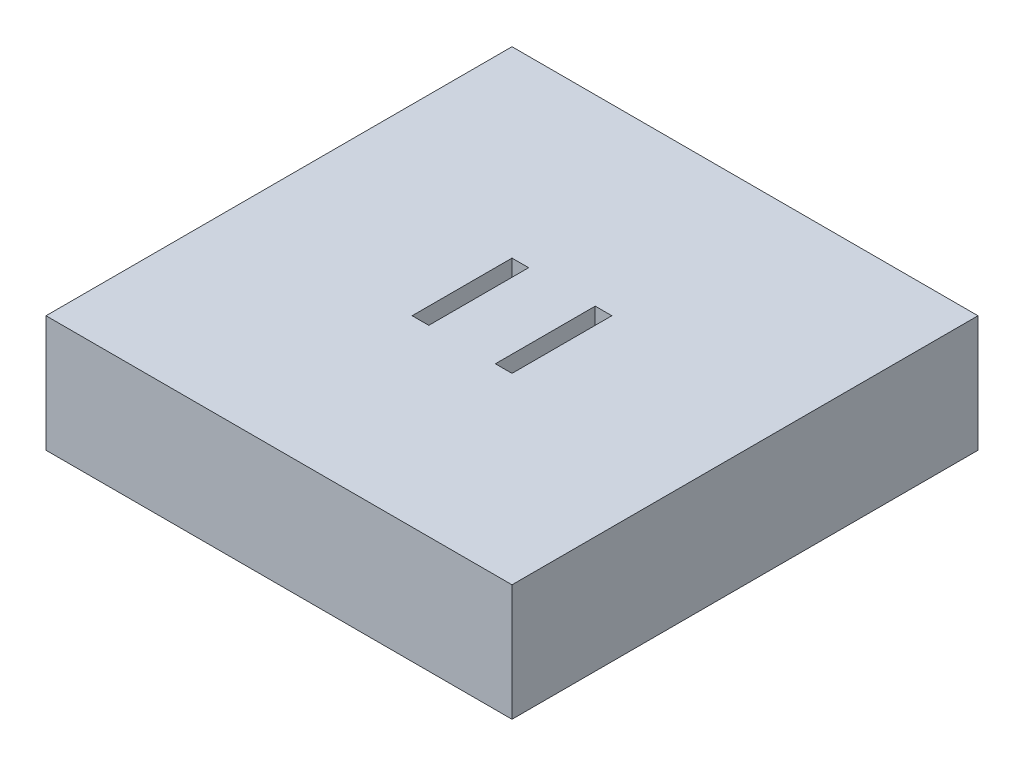
ISO-10303-21;
HEADER;
FILE_DESCRIPTION(('STEP AP214'),'2;1');
FILE_NAME('part.step','',(''),(''),'','','');
FILE_SCHEMA(('AUTOMOTIVE_DESIGN { 1 0 10303 214 1 1 1 1 }'));
ENDSEC;
DATA;
#1=APPLICATION_CONTEXT('core data for automotive mechanical design processes');
#2=APPLICATION_PROTOCOL_DEFINITION('international standard','automotive_design',2000,#1);
#3=PRODUCT_CONTEXT('',#1,'mechanical');
#4=PRODUCT('Part','Part','',(#3));
#5=PRODUCT_RELATED_PRODUCT_CATEGORY('part','',(#4));
#6=PRODUCT_DEFINITION_FORMATION('','',#4);
#7=PRODUCT_DEFINITION_CONTEXT('part definition',#1,'design');
#8=PRODUCT_DEFINITION('design','',#6,#7);
#9=PRODUCT_DEFINITION_SHAPE('','',#8);
#10=(LENGTH_UNIT() NAMED_UNIT(*) SI_UNIT(.MILLI.,.METRE.));
#11=(NAMED_UNIT(*) PLANE_ANGLE_UNIT() SI_UNIT($,.RADIAN.));
#12=(NAMED_UNIT(*) SI_UNIT($,.STERADIAN.) SOLID_ANGLE_UNIT());
#13=UNCERTAINTY_MEASURE_WITH_UNIT(LENGTH_MEASURE(1.E-05),#10,'distance_accuracy_value','');
#14=(GEOMETRIC_REPRESENTATION_CONTEXT(3) GLOBAL_UNCERTAINTY_ASSIGNED_CONTEXT((#13)) GLOBAL_UNIT_ASSIGNED_CONTEXT((#10,
#11,#12)) REPRESENTATION_CONTEXT('',''));
#15=CARTESIAN_POINT('',(0.,0.,0.));
#16=DIRECTION('',(0.,0.,1.));
#17=DIRECTION('',(1.,0.,0.));
#18=AXIS2_PLACEMENT_3D('',#15,#16,#17);
#19=CARTESIAN_POINT('',(0.,-2.5,0.));
#20=DIRECTION('',(0.,1.,0.));
#21=DIRECTION('',(0.,0.,1.));
#22=AXIS2_PLACEMENT_3D('',#19,#20,#21);
#23=PLANE('',#22);
#24=DIRECTION('',(0.,0.,1.));
#25=VECTOR('',#24,1.);
#26=CARTESIAN_POINT('',(-14.,-2.5,14.));
#27=LINE('',#26,#25);
#28=CARTESIAN_POINT('',(-14.,-2.5,-14.));
#29=VERTEX_POINT('',#28);
#30=CARTESIAN_POINT('',(-14.,-2.5,14.));
#31=VERTEX_POINT('',#30);
#32=EDGE_CURVE('E245',#29,#31,#27,.T.);
#33=ORIENTED_EDGE('',*,*,#32,.F.);
#34=DIRECTION('',(-1.,0.,0.));
#35=VECTOR('',#34,1.);
#36=CARTESIAN_POINT('',(14.,-2.5,-14.));
#37=LINE('',#36,#35);
#38=CARTESIAN_POINT('',(14.,-2.5,-14.));
#39=VERTEX_POINT('',#38);
#40=EDGE_CURVE('E252',#39,#29,#37,.T.);
#41=ORIENTED_EDGE('',*,*,#40,.F.);
#42=DIRECTION('',(0.,0.,-1.));
#43=VECTOR('',#42,1.);
#44=CARTESIAN_POINT('',(14.,-2.5,14.));
#45=LINE('',#44,#43);
#46=CARTESIAN_POINT('',(14.,-2.5,14.));
#47=VERTEX_POINT('',#46);
#48=EDGE_CURVE('E250',#47,#39,#45,.T.);
#49=ORIENTED_EDGE('',*,*,#48,.F.);
#50=DIRECTION('',(1.,0.,0.));
#51=VECTOR('',#50,1.);
#52=CARTESIAN_POINT('',(14.,-2.5,14.));
#53=LINE('',#52,#51);
#54=EDGE_CURVE('E248',#31,#47,#53,.T.);
#55=ORIENTED_EDGE('',*,*,#54,.F.);
#56=EDGE_LOOP('',(#33,#41,#49,#55));
#57=FACE_BOUND('',#56,.T.);
#58=CARTESIAN_POINT('',(0.,-2.5,0.));
#59=DIRECTION('',(0.,1.,0.));
#60=DIRECTION('',(0.,0.,1.));
#61=AXIS2_PLACEMENT_3D('',#58,#59,#60);
#62=CIRCLE('',#61,10.625);
#63=CARTESIAN_POINT('',(0.,-2.5,10.625));
#64=VERTEX_POINT('',#63);
#65=EDGE_CURVE('E242',#64,#64,#62,.T.);
#66=ORIENTED_EDGE('',*,*,#65,.T.);
#67=EDGE_LOOP('',(#66));
#68=FACE_BOUND('',#67,.T.);
#69=ADVANCED_FACE('F35',(#57,#68),#23,.F.);
#70=CARTESIAN_POINT('',(-14.,2.5,14.));
#71=DIRECTION('',(1.,0.,0.));
#72=DIRECTION('',(0.,0.,-1.));
#73=AXIS2_PLACEMENT_3D('',#70,#71,#72);
#74=PLANE('',#73);
#75=ORIENTED_EDGE('',*,*,#32,.T.);
#76=DIRECTION('',(0.,-1.,0.));
#77=VECTOR('',#76,1.);
#78=CARTESIAN_POINT('',(-14.,2.5,14.));
#79=LINE('',#78,#77);
#80=CARTESIAN_POINT('',(-14.,4.5,14.));
#81=VERTEX_POINT('',#80);
#82=EDGE_CURVE('E159',#81,#31,#79,.T.);
#83=ORIENTED_EDGE('',*,*,#82,.F.);
#84=DIRECTION('',(0.,0.,1.));
#85=VECTOR('',#84,1.);
#86=CARTESIAN_POINT('',(-14.,4.5,-14.));
#87=LINE('',#86,#85);
#88=CARTESIAN_POINT('',(-14.,4.5,-14.));
#89=VERTEX_POINT('',#88);
#90=EDGE_CURVE('E230',#89,#81,#87,.T.);
#91=ORIENTED_EDGE('',*,*,#90,.F.);
#92=DIRECTION('',(0.,-1.,0.));
#93=VECTOR('',#92,1.);
#94=CARTESIAN_POINT('',(-14.,2.5,-14.));
#95=LINE('',#94,#93);
#96=EDGE_CURVE('E254',#89,#29,#95,.T.);
#97=ORIENTED_EDGE('',*,*,#96,.T.);
#98=EDGE_LOOP('',(#75,#83,#91,#97));
#99=FACE_BOUND('',#98,.T.);
#100=ADVANCED_FACE('F318',(#99),#74,.F.);
#101=CARTESIAN_POINT('',(14.,2.5,14.));
#102=DIRECTION('',(0.,0.,-1.));
#103=DIRECTION('',(-1.,0.,0.));
#104=AXIS2_PLACEMENT_3D('',#101,#102,#103);
#105=PLANE('',#104);
#106=ORIENTED_EDGE('',*,*,#54,.T.);
#107=DIRECTION('',(0.,-1.,0.));
#108=VECTOR('',#107,1.);
#109=CARTESIAN_POINT('',(14.,2.5,14.));
#110=LINE('',#109,#108);
#111=CARTESIAN_POINT('',(14.,4.5,14.));
#112=VERTEX_POINT('',#111);
#113=EDGE_CURVE('E260',#112,#47,#110,.T.);
#114=ORIENTED_EDGE('',*,*,#113,.F.);
#115=DIRECTION('',(1.,0.,0.));
#116=VECTOR('',#115,1.);
#117=CARTESIAN_POINT('',(-14.,4.5,14.));
#118=LINE('',#117,#116);
#119=EDGE_CURVE('E233',#81,#112,#118,.T.);
#120=ORIENTED_EDGE('',*,*,#119,.F.);
#121=ORIENTED_EDGE('',*,*,#82,.T.);
#122=EDGE_LOOP('',(#106,#114,#120,#121));
#123=FACE_BOUND('',#122,.T.);
#124=ADVANCED_FACE('F324',(#123),#105,.F.);
#125=CARTESIAN_POINT('',(14.,2.5,14.));
#126=DIRECTION('',(-1.,0.,0.));
#127=DIRECTION('',(0.,0.,1.));
#128=AXIS2_PLACEMENT_3D('',#125,#126,#127);
#129=PLANE('',#128);
#130=ORIENTED_EDGE('',*,*,#48,.T.);
#131=DIRECTION('',(0.,-1.,0.));
#132=VECTOR('',#131,1.);
#133=CARTESIAN_POINT('',(14.,2.5,-14.));
#134=LINE('',#133,#132);
#135=CARTESIAN_POINT('',(14.,4.5,-14.));
#136=VERTEX_POINT('',#135);
#137=EDGE_CURVE('E257',#136,#39,#134,.T.);
#138=ORIENTED_EDGE('',*,*,#137,.F.);
#139=DIRECTION('',(0.,0.,-1.));
#140=VECTOR('',#139,1.);
#141=CARTESIAN_POINT('',(14.,4.5,14.));
#142=LINE('',#141,#140);
#143=EDGE_CURVE('E236',#112,#136,#142,.T.);
#144=ORIENTED_EDGE('',*,*,#143,.F.);
#145=ORIENTED_EDGE('',*,*,#113,.T.);
#146=EDGE_LOOP('',(#130,#138,#144,#145));
#147=FACE_BOUND('',#146,.T.);
#148=ADVANCED_FACE('F334',(#147),#129,.F.);
#149=CARTESIAN_POINT('',(14.,2.5,-14.));
#150=DIRECTION('',(0.,0.,1.));
#151=DIRECTION('',(1.,0.,0.));
#152=AXIS2_PLACEMENT_3D('',#149,#150,#151);
#153=PLANE('',#152);
#154=ORIENTED_EDGE('',*,*,#40,.T.);
#155=ORIENTED_EDGE('',*,*,#96,.F.);
#156=DIRECTION('',(-1.,0.,0.));
#157=VECTOR('',#156,1.);
#158=CARTESIAN_POINT('',(14.,4.5,-14.));
#159=LINE('',#158,#157);
#160=EDGE_CURVE('E227',#136,#89,#159,.T.);
#161=ORIENTED_EDGE('',*,*,#160,.F.);
#162=ORIENTED_EDGE('',*,*,#137,.T.);
#163=EDGE_LOOP('',(#154,#155,#161,#162));
#164=FACE_BOUND('',#163,.T.);
#165=ADVANCED_FACE('F331',(#164),#153,.F.);
#166=CARTESIAN_POINT('',(0.,2.5,0.));
#167=DIRECTION('',(0.,-1.,0.));
#168=DIRECTION('',(0.,0.,-1.));
#169=AXIS2_PLACEMENT_3D('',#166,#167,#168);
#170=CYLINDRICAL_SURFACE('',#169,10.625);
#171=CARTESIAN_POINT('',(0.,2.5,0.));
#172=DIRECTION('',(0.,1.,0.));
#173=DIRECTION('',(0.,0.,1.));
#174=AXIS2_PLACEMENT_3D('',#171,#172,#173);
#175=CIRCLE('',#174,10.625);
#176=CARTESIAN_POINT('',(0.,2.5,10.625));
#177=VERTEX_POINT('',#176);
#178=EDGE_CURVE('E239',#177,#177,#175,.T.);
#179=ORIENTED_EDGE('',*,*,#178,.T.);
#180=EDGE_LOOP('',(#179));
#181=FACE_BOUND('',#180,.T.);
#182=ORIENTED_EDGE('',*,*,#65,.F.);
#183=EDGE_LOOP('',(#182));
#184=FACE_BOUND('',#183,.T.);
#185=ADVANCED_FACE('F314',(#181,#184),#170,.F.);
#186=CARTESIAN_POINT('',(0.,2.5,0.));
#187=DIRECTION('',(0.,1.,0.));
#188=DIRECTION('',(0.,0.,1.));
#189=AXIS2_PLACEMENT_3D('',#186,#187,#188);
#190=PLANE('',#189);
#191=DIRECTION('',(-1.,0.,0.));
#192=VECTOR('',#191,1.);
#193=CARTESIAN_POINT('',(-2.,2.5,-4.00000000000001));
#194=LINE('',#193,#192);
#195=CARTESIAN_POINT('',(2.,2.5,-4.00000000000001));
#196=VERTEX_POINT('',#195);
#197=CARTESIAN_POINT('',(-2.,2.5,-4.00000000000001));
#198=VERTEX_POINT('',#197);
#199=EDGE_CURVE('E268',#196,#198,#194,.T.);
#200=ORIENTED_EDGE('',*,*,#199,.T.);
#201=DIRECTION('',(0.,0.,-1.));
#202=VECTOR('',#201,1.);
#203=CARTESIAN_POINT('',(-2.,2.5,-4.00000000000001));
#204=LINE('',#203,#202);
#205=CARTESIAN_POINT('',(-2.,2.5,-3.));
#206=VERTEX_POINT('',#205);
#207=EDGE_CURVE('E270',#198,#206,#204,.F.);
#208=ORIENTED_EDGE('',*,*,#207,.T.);
#209=DIRECTION('',(-1.,0.,0.));
#210=VECTOR('',#209,1.);
#211=CARTESIAN_POINT('',(-2.,2.5,-3.));
#212=LINE('',#211,#210);
#213=CARTESIAN_POINT('',(-3.,2.5,-3.));
#214=VERTEX_POINT('',#213);
#215=EDGE_CURVE('E212',#206,#214,#212,.T.);
#216=ORIENTED_EDGE('',*,*,#215,.T.);
#217=DIRECTION('',(0.,0.,1.));
#218=VECTOR('',#217,1.);
#219=CARTESIAN_POINT('',(-3.,2.5,-3.));
#220=LINE('',#219,#218);
#221=CARTESIAN_POINT('',(-3.,2.5,3.));
#222=VERTEX_POINT('',#221);
#223=EDGE_CURVE('E201',#214,#222,#220,.T.);
#224=ORIENTED_EDGE('',*,*,#223,.T.);
#225=DIRECTION('',(1.,0.,0.));
#226=VECTOR('',#225,1.);
#227=CARTESIAN_POINT('',(-3.,2.5,3.));
#228=LINE('',#227,#226);
#229=CARTESIAN_POINT('',(-2.,2.5,3.));
#230=VERTEX_POINT('',#229);
#231=EDGE_CURVE('E197',#222,#230,#228,.T.);
#232=ORIENTED_EDGE('',*,*,#231,.T.);
#233=DIRECTION('',(0.,0.,-1.));
#234=VECTOR('',#233,1.);
#235=CARTESIAN_POINT('',(-2.,2.5,3.));
#236=LINE('',#235,#234);
#237=CARTESIAN_POINT('',(-2.,2.5,4.));
#238=VERTEX_POINT('',#237);
#239=EDGE_CURVE('E51',#230,#238,#236,.F.);
#240=ORIENTED_EDGE('',*,*,#239,.T.);
#241=DIRECTION('',(1.,0.,0.));
#242=VECTOR('',#241,1.);
#243=CARTESIAN_POINT('',(0.,2.5,4.));
#244=LINE('',#243,#242);
#245=CARTESIAN_POINT('',(2.,2.5,4.));
#246=VERTEX_POINT('',#245);
#247=EDGE_CURVE('E157',#238,#246,#244,.T.);
#248=ORIENTED_EDGE('',*,*,#247,.T.);
#249=DIRECTION('',(0.,0.,-1.));
#250=VECTOR('',#249,1.);
#251=CARTESIAN_POINT('',(2.,2.5,4.));
#252=LINE('',#251,#250);
#253=CARTESIAN_POINT('',(2.,2.5,3.));
#254=VERTEX_POINT('',#253);
#255=EDGE_CURVE('E149',#246,#254,#252,.T.);
#256=ORIENTED_EDGE('',*,*,#255,.T.);
#257=DIRECTION('',(1.,0.,0.));
#258=VECTOR('',#257,1.);
#259=CARTESIAN_POINT('',(3.,2.5,3.));
#260=LINE('',#259,#258);
#261=CARTESIAN_POINT('',(3.,2.5,3.));
#262=VERTEX_POINT('',#261);
#263=EDGE_CURVE('E155',#254,#262,#260,.T.);
#264=ORIENTED_EDGE('',*,*,#263,.T.);
#265=DIRECTION('',(0.,0.,-1.));
#266=VECTOR('',#265,1.);
#267=CARTESIAN_POINT('',(3.,2.5,-3.));
#268=LINE('',#267,#266);
#269=CARTESIAN_POINT('',(3.,2.5,-3.));
#270=VERTEX_POINT('',#269);
#271=EDGE_CURVE('E170',#262,#270,#268,.T.);
#272=ORIENTED_EDGE('',*,*,#271,.T.);
#273=DIRECTION('',(-1.,0.,0.));
#274=VECTOR('',#273,1.);
#275=CARTESIAN_POINT('',(2.,2.5,-3.));
#276=LINE('',#275,#274);
#277=CARTESIAN_POINT('',(2.,2.5,-3.));
#278=VERTEX_POINT('',#277);
#279=EDGE_CURVE('E182',#270,#278,#276,.T.);
#280=ORIENTED_EDGE('',*,*,#279,.T.);
#281=DIRECTION('',(0.,0.,-1.));
#282=VECTOR('',#281,1.);
#283=CARTESIAN_POINT('',(2.,2.5,-3.));
#284=LINE('',#283,#282);
#285=EDGE_CURVE('E58',#278,#196,#284,.T.);
#286=ORIENTED_EDGE('',*,*,#285,.T.);
#287=EDGE_LOOP('',(#200,#208,#216,#224,#232,#240,#248,#256,#264,#272,#280,#286));
#288=FACE_BOUND('',#287,.T.);
#289=ORIENTED_EDGE('',*,*,#178,.F.);
#290=EDGE_LOOP('',(#289));
#291=FACE_BOUND('',#290,.T.);
#292=ADVANCED_FACE('F152',(#288,#291),#190,.F.);
#293=CARTESIAN_POINT('',(0.,4.5,0.));
#294=DIRECTION('',(0.,1.,0.));
#295=DIRECTION('',(0.,0.,1.));
#296=AXIS2_PLACEMENT_3D('',#293,#294,#295);
#297=PLANE('',#296);
#298=ORIENTED_EDGE('',*,*,#160,.T.);
#299=ORIENTED_EDGE('',*,*,#90,.T.);
#300=ORIENTED_EDGE('',*,*,#119,.T.);
#301=ORIENTED_EDGE('',*,*,#143,.T.);
#302=EDGE_LOOP('',(#298,#299,#300,#301));
#303=FACE_BOUND('',#302,.T.);
#304=DIRECTION('',(0.,0.,-1.));
#305=VECTOR('',#304,1.);
#306=CARTESIAN_POINT('',(-2.,4.5,3.));
#307=LINE('',#306,#305);
#308=CARTESIAN_POINT('',(-2.,4.5,3.));
#309=VERTEX_POINT('',#308);
#310=CARTESIAN_POINT('',(-2.,4.5,-3.));
#311=VERTEX_POINT('',#310);
#312=EDGE_CURVE('E200',#309,#311,#307,.T.);
#313=ORIENTED_EDGE('',*,*,#312,.F.);
#314=DIRECTION('',(1.,0.,0.));
#315=VECTOR('',#314,1.);
#316=CARTESIAN_POINT('',(-3.,4.5,3.));
#317=LINE('',#316,#315);
#318=CARTESIAN_POINT('',(-3.,4.5,3.));
#319=VERTEX_POINT('',#318);
#320=EDGE_CURVE('E198',#319,#309,#317,.T.);
#321=ORIENTED_EDGE('',*,*,#320,.F.);
#322=DIRECTION('',(0.,0.,1.));
#323=VECTOR('',#322,1.);
#324=CARTESIAN_POINT('',(-3.,4.5,-3.));
#325=LINE('',#324,#323);
#326=CARTESIAN_POINT('',(-3.,4.5,-3.));
#327=VERTEX_POINT('',#326);
#328=EDGE_CURVE('E206',#327,#319,#325,.T.);
#329=ORIENTED_EDGE('',*,*,#328,.F.);
#330=DIRECTION('',(-1.,0.,0.));
#331=VECTOR('',#330,1.);
#332=CARTESIAN_POINT('',(-2.,4.5,-3.));
#333=LINE('',#332,#331);
#334=EDGE_CURVE('E203',#311,#327,#333,.T.);
#335=ORIENTED_EDGE('',*,*,#334,.F.);
#336=EDGE_LOOP('',(#313,#321,#329,#335));
#337=FACE_BOUND('',#336,.T.);
#338=DIRECTION('',(0.,0.,1.));
#339=VECTOR('',#338,1.);
#340=CARTESIAN_POINT('',(2.,4.5,3.));
#341=LINE('',#340,#339);
#342=CARTESIAN_POINT('',(2.,4.5,-3.));
#343=VERTEX_POINT('',#342);
#344=CARTESIAN_POINT('',(2.,4.5,3.));
#345=VERTEX_POINT('',#344);
#346=EDGE_CURVE('E178',#343,#345,#341,.T.);
#347=ORIENTED_EDGE('',*,*,#346,.F.);
#348=DIRECTION('',(-1.,0.,0.));
#349=VECTOR('',#348,1.);
#350=CARTESIAN_POINT('',(2.,4.5,-3.));
#351=LINE('',#350,#349);
#352=CARTESIAN_POINT('',(3.,4.5,-3.));
#353=VERTEX_POINT('',#352);
#354=EDGE_CURVE('E189',#353,#343,#351,.T.);
#355=ORIENTED_EDGE('',*,*,#354,.F.);
#356=DIRECTION('',(0.,0.,-1.));
#357=VECTOR('',#356,1.);
#358=CARTESIAN_POINT('',(3.,4.5,-3.));
#359=LINE('',#358,#357);
#360=CARTESIAN_POINT('',(3.,4.5,3.));
#361=VERTEX_POINT('',#360);
#362=EDGE_CURVE('E193',#361,#353,#359,.T.);
#363=ORIENTED_EDGE('',*,*,#362,.F.);
#364=DIRECTION('',(1.,0.,0.));
#365=VECTOR('',#364,1.);
#366=CARTESIAN_POINT('',(3.,4.5,3.));
#367=LINE('',#366,#365);
#368=EDGE_CURVE('E293',#345,#361,#367,.T.);
#369=ORIENTED_EDGE('',*,*,#368,.F.);
#370=EDGE_LOOP('',(#347,#355,#363,#369));
#371=FACE_BOUND('',#370,.T.);
#372=ADVANCED_FACE('F302',(#303,#337,#371),#297,.T.);
#373=CARTESIAN_POINT('',(-3.,4.5,3.));
#374=DIRECTION('',(0.,0.,-1.));
#375=DIRECTION('',(-1.,0.,0.));
#376=AXIS2_PLACEMENT_3D('',#373,#374,#375);
#377=PLANE('',#376);
#378=ORIENTED_EDGE('',*,*,#231,.F.);
#379=DIRECTION('',(0.,-1.,0.));
#380=VECTOR('',#379,1.);
#381=CARTESIAN_POINT('',(-3.,4.5,3.));
#382=LINE('',#381,#380);
#383=EDGE_CURVE('E208',#319,#222,#382,.T.);
#384=ORIENTED_EDGE('',*,*,#383,.F.);
#385=ORIENTED_EDGE('',*,*,#320,.T.);
#386=DIRECTION('',(0.,-1.,0.));
#387=VECTOR('',#386,1.);
#388=CARTESIAN_POINT('',(-2.,4.5,3.));
#389=LINE('',#388,#387);
#390=EDGE_CURVE('E224',#309,#230,#389,.T.);
#391=ORIENTED_EDGE('',*,*,#390,.T.);
#392=EDGE_LOOP('',(#378,#384,#385,#391));
#393=FACE_BOUND('',#392,.T.);
#394=ADVANCED_FACE('F304',(#393),#377,.T.);
#395=CARTESIAN_POINT('',(-2.,4.5,3.));
#396=DIRECTION('',(-1.,0.,0.));
#397=DIRECTION('',(0.,0.,1.));
#398=AXIS2_PLACEMENT_3D('',#395,#396,#397);
#399=PLANE('',#398);
#400=DIRECTION('',(0.,0.,-1.));
#401=VECTOR('',#400,1.);
#402=CARTESIAN_POINT('',(-2.,2.5,3.));
#403=LINE('',#402,#401);
#404=EDGE_CURVE('E210',#230,#206,#403,.T.);
#405=ORIENTED_EDGE('',*,*,#404,.F.);
#406=ORIENTED_EDGE('',*,*,#390,.F.);
#407=ORIENTED_EDGE('',*,*,#312,.T.);
#408=DIRECTION('',(0.,-1.,0.));
#409=VECTOR('',#408,1.);
#410=CARTESIAN_POINT('',(-2.,4.5,-3.));
#411=LINE('',#410,#409);
#412=EDGE_CURVE('E221',#311,#206,#411,.T.);
#413=ORIENTED_EDGE('',*,*,#412,.T.);
#414=EDGE_LOOP('',(#405,#406,#407,#413));
#415=FACE_BOUND('',#414,.T.);
#416=ADVANCED_FACE('F311',(#415),#399,.T.);
#417=CARTESIAN_POINT('',(-2.,4.5,-3.));
#418=DIRECTION('',(0.,0.,1.));
#419=DIRECTION('',(1.,0.,0.));
#420=AXIS2_PLACEMENT_3D('',#417,#418,#419);
#421=PLANE('',#420);
#422=ORIENTED_EDGE('',*,*,#215,.F.);
#423=ORIENTED_EDGE('',*,*,#412,.F.);
#424=ORIENTED_EDGE('',*,*,#334,.T.);
#425=DIRECTION('',(0.,-1.,0.));
#426=VECTOR('',#425,1.);
#427=CARTESIAN_POINT('',(-3.,4.5,-3.));
#428=LINE('',#427,#426);
#429=EDGE_CURVE('E219',#327,#214,#428,.T.);
#430=ORIENTED_EDGE('',*,*,#429,.T.);
#431=EDGE_LOOP('',(#422,#423,#424,#430));
#432=FACE_BOUND('',#431,.T.);
#433=ADVANCED_FACE('F367',(#432),#421,.T.);
#434=CARTESIAN_POINT('',(-3.,4.5,-3.));
#435=DIRECTION('',(1.,0.,0.));
#436=DIRECTION('',(0.,0.,-1.));
#437=AXIS2_PLACEMENT_3D('',#434,#435,#436);
#438=PLANE('',#437);
#439=ORIENTED_EDGE('',*,*,#223,.F.);
#440=ORIENTED_EDGE('',*,*,#429,.F.);
#441=ORIENTED_EDGE('',*,*,#328,.T.);
#442=ORIENTED_EDGE('',*,*,#383,.T.);
#443=EDGE_LOOP('',(#439,#440,#441,#442));
#444=FACE_BOUND('',#443,.T.);
#445=ADVANCED_FACE('F371',(#444),#438,.T.);
#446=CARTESIAN_POINT('',(2.,4.5,-3.));
#447=DIRECTION('',(0.,0.,1.));
#448=DIRECTION('',(1.,0.,0.));
#449=AXIS2_PLACEMENT_3D('',#446,#447,#448);
#450=PLANE('',#449);
#451=ORIENTED_EDGE('',*,*,#279,.F.);
#452=DIRECTION('',(0.,-1.,0.));
#453=VECTOR('',#452,1.);
#454=CARTESIAN_POINT('',(3.,4.5,-3.));
#455=LINE('',#454,#453);
#456=EDGE_CURVE('E190',#353,#270,#455,.T.);
#457=ORIENTED_EDGE('',*,*,#456,.F.);
#458=ORIENTED_EDGE('',*,*,#354,.T.);
#459=DIRECTION('',(0.,-1.,0.));
#460=VECTOR('',#459,1.);
#461=CARTESIAN_POINT('',(2.,4.5,-3.));
#462=LINE('',#461,#460);
#463=EDGE_CURVE('E179',#343,#278,#462,.T.);
#464=ORIENTED_EDGE('',*,*,#463,.T.);
#465=EDGE_LOOP('',(#451,#457,#458,#464));
#466=FACE_BOUND('',#465,.T.);
#467=ADVANCED_FACE('F301',(#466),#450,.T.);
#468=CARTESIAN_POINT('',(2.,4.5,3.));
#469=DIRECTION('',(1.,0.,0.));
#470=DIRECTION('',(0.,0.,-1.));
#471=AXIS2_PLACEMENT_3D('',#468,#469,#470);
#472=PLANE('',#471);
#473=DIRECTION('',(0.,0.,1.));
#474=VECTOR('',#473,1.);
#475=CARTESIAN_POINT('',(2.,2.5,3.));
#476=LINE('',#475,#474);
#477=EDGE_CURVE('E171',#278,#254,#476,.T.);
#478=ORIENTED_EDGE('',*,*,#477,.F.);
#479=ORIENTED_EDGE('',*,*,#463,.F.);
#480=ORIENTED_EDGE('',*,*,#346,.T.);
#481=DIRECTION('',(0.,-1.,0.));
#482=VECTOR('',#481,1.);
#483=CARTESIAN_POINT('',(2.,4.5,3.));
#484=LINE('',#483,#482);
#485=EDGE_CURVE('E166',#345,#254,#484,.T.);
#486=ORIENTED_EDGE('',*,*,#485,.T.);
#487=EDGE_LOOP('',(#478,#479,#480,#486));
#488=FACE_BOUND('',#487,.T.);
#489=ADVANCED_FACE('F175',(#488),#472,.T.);
#490=CARTESIAN_POINT('',(3.,4.5,3.));
#491=DIRECTION('',(0.,0.,-1.));
#492=DIRECTION('',(-1.,0.,0.));
#493=AXIS2_PLACEMENT_3D('',#490,#491,#492);
#494=PLANE('',#493);
#495=ORIENTED_EDGE('',*,*,#263,.F.);
#496=ORIENTED_EDGE('',*,*,#485,.F.);
#497=ORIENTED_EDGE('',*,*,#368,.T.);
#498=DIRECTION('',(0.,-1.,0.));
#499=VECTOR('',#498,1.);
#500=CARTESIAN_POINT('',(3.,4.5,3.));
#501=LINE('',#500,#499);
#502=EDGE_CURVE('E168',#361,#262,#501,.T.);
#503=ORIENTED_EDGE('',*,*,#502,.T.);
#504=EDGE_LOOP('',(#495,#496,#497,#503));
#505=FACE_BOUND('',#504,.T.);
#506=ADVANCED_FACE('F164',(#505),#494,.T.);
#507=CARTESIAN_POINT('',(3.,4.5,-3.));
#508=DIRECTION('',(-1.,0.,0.));
#509=DIRECTION('',(0.,0.,1.));
#510=AXIS2_PLACEMENT_3D('',#507,#508,#509);
#511=PLANE('',#510);
#512=ORIENTED_EDGE('',*,*,#271,.F.);
#513=ORIENTED_EDGE('',*,*,#502,.F.);
#514=ORIENTED_EDGE('',*,*,#362,.T.);
#515=ORIENTED_EDGE('',*,*,#456,.T.);
#516=EDGE_LOOP('',(#512,#513,#514,#515));
#517=FACE_BOUND('',#516,.T.);
#518=ADVANCED_FACE('F297',(#517),#511,.T.);
#519=CARTESIAN_POINT('',(0.,3.0528336096874,3.));
#520=DIRECTION('',(0.,0.,-1.));
#521=DIRECTION('',(-1.,0.,0.));
#522=AXIS2_PLACEMENT_3D('',#519,#520,#521);
#523=CYLINDRICAL_SURFACE('',#522,2.075);
#524=ORIENTED_EDGE('',*,*,#404,.T.);
#525=ORIENTED_EDGE('',*,*,#207,.F.);
#526=CARTESIAN_POINT('',(0.,3.0528336096874,-4.55283360968741));
#527=DIRECTION('',(0.,-0.707106781186551,-0.707106781186544));
#528=DIRECTION('',(0.,0.707106781186544,-0.707106781186551));
#529=AXIS2_PLACEMENT_3D('',#526,#527,#528);
#530=ELLIPSE('',#529,2.93449314192419,2.075);
#531=CARTESIAN_POINT('',(-1.37634762346771,1.5,-3.));
#532=VERTEX_POINT('',#531);
#533=EDGE_CURVE('E277',#198,#532,#530,.F.);
#534=ORIENTED_EDGE('',*,*,#533,.T.);
#535=CARTESIAN_POINT('',(0.,3.0528336096874,-3.));
#536=DIRECTION('',(0.,0.,1.));
#537=DIRECTION('',(1.,0.,0.));
#538=AXIS2_PLACEMENT_3D('',#535,#536,#537);
#539=CIRCLE('',#538,2.075);
#540=CARTESIAN_POINT('',(1.37634762346771,1.5,-3.));
#541=VERTEX_POINT('',#540);
#542=EDGE_CURVE('E286',#532,#541,#539,.T.);
#543=ORIENTED_EDGE('',*,*,#542,.T.);
#544=CARTESIAN_POINT('',(0.,3.0528336096874,-4.55283360968741));
#545=DIRECTION('',(0.,-0.707106781186551,-0.707106781186544));
#546=DIRECTION('',(0.,0.707106781186544,-0.707106781186551));
#547=AXIS2_PLACEMENT_3D('',#544,#545,#546);
#548=ELLIPSE('',#547,2.93449314192419,2.075);
#549=EDGE_CURVE('E279',#541,#196,#548,.F.);
#550=ORIENTED_EDGE('',*,*,#549,.T.);
#551=ORIENTED_EDGE('',*,*,#285,.F.);
#552=ORIENTED_EDGE('',*,*,#477,.T.);
#553=ORIENTED_EDGE('',*,*,#255,.F.);
#554=CARTESIAN_POINT('',(0.,3.0528336096874,4.55283360968739));
#555=DIRECTION('',(0.,0.707106781186544,-0.707106781186551));
#556=DIRECTION('',(0.,-0.707106781186551,-0.707106781186544));
#557=AXIS2_PLACEMENT_3D('',#554,#555,#556);
#558=ELLIPSE('',#557,2.93449314192416,2.075);
#559=CARTESIAN_POINT('',(1.3763476234677,1.49999999999999,3.));
#560=VERTEX_POINT('',#559);
#561=EDGE_CURVE('E11',#246,#560,#558,.T.);
#562=ORIENTED_EDGE('',*,*,#561,.T.);
#563=CARTESIAN_POINT('',(0.,3.0528336096874,3.));
#564=DIRECTION('',(0.,0.,1.));
#565=DIRECTION('',(1.,0.,0.));
#566=AXIS2_PLACEMENT_3D('',#563,#564,#565);
#567=CIRCLE('',#566,2.075);
#568=CARTESIAN_POINT('',(-1.37634762346769,1.49999999999999,3.));
#569=VERTEX_POINT('',#568);
#570=EDGE_CURVE('E184',#569,#560,#567,.T.);
#571=ORIENTED_EDGE('',*,*,#570,.F.);
#572=CARTESIAN_POINT('',(0.,3.0528336096874,4.55283360968739));
#573=DIRECTION('',(0.,0.707106781186544,-0.707106781186551));
#574=DIRECTION('',(0.,-0.707106781186551,-0.707106781186544));
#575=AXIS2_PLACEMENT_3D('',#572,#573,#574);
#576=ELLIPSE('',#575,2.93449314192416,2.075);
#577=EDGE_CURVE('E44',#569,#238,#576,.T.);
#578=ORIENTED_EDGE('',*,*,#577,.T.);
#579=ORIENTED_EDGE('',*,*,#239,.F.);
#580=EDGE_LOOP('',(#524,#525,#534,#543,#550,#551,#552,#553,#562,#571,#578,#579));
#581=FACE_BOUND('',#580,.T.);
#582=ADVANCED_FACE('F181',(#581),#523,.T.);
#583=CARTESIAN_POINT('',(0.,3.0528336096874,3.));
#584=DIRECTION('',(0.,0.,1.));
#585=DIRECTION('',(1.,0.,0.));
#586=AXIS2_PLACEMENT_3D('',#583,#584,#585);
#587=PLANE('',#586);
#588=ORIENTED_EDGE('',*,*,#570,.T.);
#589=DIRECTION('',(-1.,0.,0.));
#590=VECTOR('',#589,1.);
#591=CARTESIAN_POINT('',(0.,1.49999999999999,3.));
#592=LINE('',#591,#590);
#593=EDGE_CURVE('E274',#560,#569,#592,.T.);
#594=ORIENTED_EDGE('',*,*,#593,.T.);
#595=EDGE_LOOP('',(#588,#594));
#596=FACE_BOUND('',#595,.T.);
#597=ADVANCED_FACE('F285',(#596),#587,.T.);
#598=CARTESIAN_POINT('',(0.,3.0528336096874,-3.));
#599=DIRECTION('',(0.,0.,1.));
#600=DIRECTION('',(1.,0.,0.));
#601=AXIS2_PLACEMENT_3D('',#598,#599,#600);
#602=PLANE('',#601);
#603=ORIENTED_EDGE('',*,*,#542,.F.);
#604=DIRECTION('',(1.,0.,0.));
#605=VECTOR('',#604,1.);
#606=CARTESIAN_POINT('',(2.,1.5,-3.));
#607=LINE('',#606,#605);
#608=EDGE_CURVE('E272',#532,#541,#607,.T.);
#609=ORIENTED_EDGE('',*,*,#608,.T.);
#610=EDGE_LOOP('',(#603,#609));
#611=FACE_BOUND('',#610,.T.);
#612=ADVANCED_FACE('F346',(#611),#602,.F.);
#613=CARTESIAN_POINT('',(0.,2.5,-4.00000000000001));
#614=DIRECTION('',(0.,-0.707106781186551,-0.707106781186544));
#615=DIRECTION('',(1.,0.,0.));
#616=AXIS2_PLACEMENT_3D('',#613,#614,#615);
#617=PLANE('',#616);
#618=ORIENTED_EDGE('',*,*,#549,.F.);
#619=ORIENTED_EDGE('',*,*,#608,.F.);
#620=ORIENTED_EDGE('',*,*,#533,.F.);
#621=ORIENTED_EDGE('',*,*,#199,.F.);
#622=EDGE_LOOP('',(#618,#619,#620,#621));
#623=FACE_BOUND('',#622,.T.);
#624=ADVANCED_FACE('F342',(#623),#617,.T.);
#625=CARTESIAN_POINT('',(0.,1.49999999999999,3.));
#626=DIRECTION('',(0.,0.707106781186544,-0.707106781186551));
#627=DIRECTION('',(-1.,0.,0.));
#628=AXIS2_PLACEMENT_3D('',#625,#626,#627);
#629=PLANE('',#628);
#630=ORIENTED_EDGE('',*,*,#561,.F.);
#631=ORIENTED_EDGE('',*,*,#247,.F.);
#632=ORIENTED_EDGE('',*,*,#577,.F.);
#633=ORIENTED_EDGE('',*,*,#593,.F.);
#634=EDGE_LOOP('',(#630,#631,#632,#633));
#635=FACE_BOUND('',#634,.T.);
#636=ADVANCED_FACE('F38',(#635),#629,.F.);
#637=CLOSED_SHELL('',(#69,#100,#124,#148,#165,#185,#292,#372,#394,#416,#433,#445,#467,#489,#506,
#518,#582,#597,#612,#624,#636));
#638=MANIFOLD_SOLID_BREP('B2',#637);
#639=ADVANCED_BREP_SHAPE_REPRESENTATION('',(#18,#638),#14);
#640=SHAPE_DEFINITION_REPRESENTATION(#9,#639);
ENDSEC;
END-ISO-10303-21;
